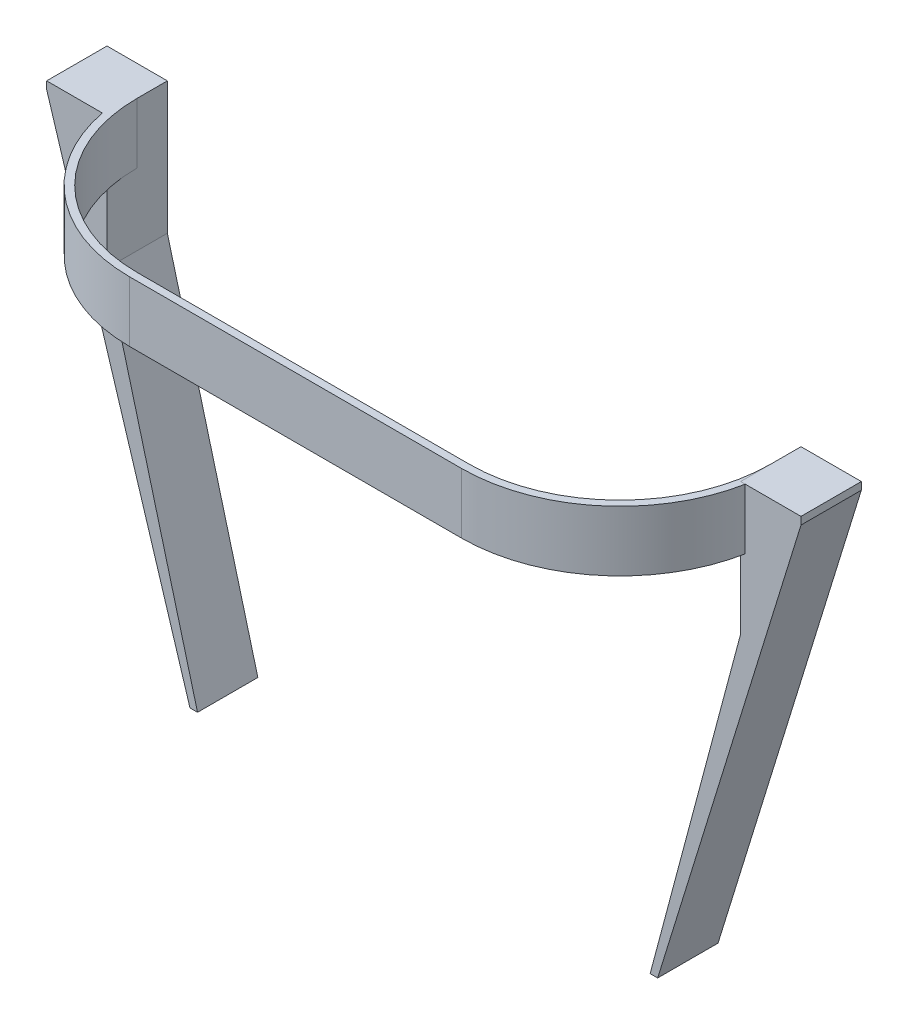
ISO-10303-21;
HEADER;
FILE_DESCRIPTION(('STEP AP214'),'2;1');
FILE_NAME('part.step','',(''),(''),'','','');
FILE_SCHEMA(('AUTOMOTIVE_DESIGN { 1 0 10303 214 1 1 1 1 }'));
ENDSEC;
DATA;
#1=APPLICATION_CONTEXT('core data for automotive mechanical design processes');
#2=APPLICATION_PROTOCOL_DEFINITION('international standard','automotive_design',2000,#1);
#3=PRODUCT_CONTEXT('',#1,'mechanical');
#4=PRODUCT('Part','Part','',(#3));
#5=PRODUCT_RELATED_PRODUCT_CATEGORY('part','',(#4));
#6=PRODUCT_DEFINITION_FORMATION('','',#4);
#7=PRODUCT_DEFINITION_CONTEXT('part definition',#1,'design');
#8=PRODUCT_DEFINITION('design','',#6,#7);
#9=PRODUCT_DEFINITION_SHAPE('','',#8);
#10=(LENGTH_UNIT() NAMED_UNIT(*) SI_UNIT(.MILLI.,.METRE.));
#11=(NAMED_UNIT(*) PLANE_ANGLE_UNIT() SI_UNIT($,.RADIAN.));
#12=(NAMED_UNIT(*) SI_UNIT($,.STERADIAN.) SOLID_ANGLE_UNIT());
#13=UNCERTAINTY_MEASURE_WITH_UNIT(LENGTH_MEASURE(1.E-05),#10,'distance_accuracy_value','');
#14=(GEOMETRIC_REPRESENTATION_CONTEXT(3) GLOBAL_UNCERTAINTY_ASSIGNED_CONTEXT((#13)) GLOBAL_UNIT_ASSIGNED_CONTEXT((#10,
#11,#12)) REPRESENTATION_CONTEXT('',''));
#15=CARTESIAN_POINT('',(0.,0.,0.));
#16=DIRECTION('',(0.,0.,1.));
#17=DIRECTION('',(1.,0.,0.));
#18=AXIS2_PLACEMENT_3D('',#15,#16,#17);
#19=CARTESIAN_POINT('',(124.,0.,32.));
#20=DIRECTION('',(0.,1.,0.));
#21=DIRECTION('',(0.,0.,1.));
#22=AXIS2_PLACEMENT_3D('',#19,#20,#21);
#23=PLANE('',#22);
#24=DIRECTION('',(1.,0.,0.));
#25=VECTOR('',#24,1.);
#26=CARTESIAN_POINT('',(124.,0.,0.));
#27=LINE('',#26,#25);
#28=CARTESIAN_POINT('',(120.,0.,0.));
#29=VERTEX_POINT('',#28);
#30=CARTESIAN_POINT('',(124.,0.,0.));
#31=VERTEX_POINT('',#30);
#32=EDGE_CURVE('E131',#29,#31,#27,.T.);
#33=ORIENTED_EDGE('',*,*,#32,.T.);
#34=DIRECTION('',(0.,0.,-1.));
#35=VECTOR('',#34,1.);
#36=CARTESIAN_POINT('',(124.,0.,32.));
#37=LINE('',#36,#35);
#38=CARTESIAN_POINT('',(124.,0.,32.));
#39=VERTEX_POINT('',#38);
#40=EDGE_CURVE('E12',#39,#31,#37,.T.);
#41=ORIENTED_EDGE('',*,*,#40,.F.);
#42=DIRECTION('',(1.,0.,0.));
#43=VECTOR('',#42,1.);
#44=CARTESIAN_POINT('',(124.,0.,32.));
#45=LINE('',#44,#43);
#46=CARTESIAN_POINT('',(120.,0.,32.));
#47=VERTEX_POINT('',#46);
#48=EDGE_CURVE('E141',#47,#39,#45,.T.);
#49=ORIENTED_EDGE('',*,*,#48,.F.);
#50=DIRECTION('',(0.,0.,-1.));
#51=VECTOR('',#50,1.);
#52=CARTESIAN_POINT('',(120.,0.,32.));
#53=LINE('',#52,#51);
#54=EDGE_CURVE('E127',#47,#29,#53,.T.);
#55=ORIENTED_EDGE('',*,*,#54,.T.);
#56=EDGE_LOOP('',(#33,#41,#49,#55));
#57=FACE_BOUND('',#56,.T.);
#58=ADVANCED_FACE('F47',(#57),#23,.F.);
#59=CARTESIAN_POINT('',(200.,246.,32.));
#60=DIRECTION('',(-0.955442479305631,0.295177351330195,0.));
#61=DIRECTION('',(-0.295177351330195,-0.955442479305631,0.));
#62=AXIS2_PLACEMENT_3D('',#59,#60,#61);
#63=PLANE('',#62);
#64=DIRECTION('',(0.295177351330195,0.955442479305631,0.));
#65=VECTOR('',#64,1.);
#66=CARTESIAN_POINT('',(200.,246.,0.));
#67=LINE('',#66,#65);
#68=CARTESIAN_POINT('',(200.,246.,0.));
#69=VERTEX_POINT('',#68);
#70=EDGE_CURVE('E134',#31,#69,#67,.T.);
#71=ORIENTED_EDGE('',*,*,#70,.T.);
#72=DIRECTION('',(0.,0.,-1.));
#73=VECTOR('',#72,1.);
#74=CARTESIAN_POINT('',(200.,246.,32.));
#75=LINE('',#74,#73);
#76=CARTESIAN_POINT('',(200.,246.,32.));
#77=VERTEX_POINT('',#76);
#78=EDGE_CURVE('E55',#77,#69,#75,.T.);
#79=ORIENTED_EDGE('',*,*,#78,.F.);
#80=DIRECTION('',(0.295177351330195,0.955442479305631,0.));
#81=VECTOR('',#80,1.);
#82=CARTESIAN_POINT('',(200.,246.,32.));
#83=LINE('',#82,#81);
#84=EDGE_CURVE('E100',#39,#77,#83,.T.);
#85=ORIENTED_EDGE('',*,*,#84,.F.);
#86=ORIENTED_EDGE('',*,*,#40,.T.);
#87=EDGE_LOOP('',(#71,#79,#85,#86));
#88=FACE_BOUND('',#87,.T.);
#89=ADVANCED_FACE('F165',(#88),#63,.F.);
#90=CARTESIAN_POINT('',(200.,250.,32.));
#91=DIRECTION('',(-1.,0.,0.));
#92=DIRECTION('',(0.,0.,1.));
#93=AXIS2_PLACEMENT_3D('',#90,#91,#92);
#94=PLANE('',#93);
#95=DIRECTION('',(0.,1.,0.));
#96=VECTOR('',#95,1.);
#97=CARTESIAN_POINT('',(200.,250.,0.));
#98=LINE('',#97,#96);
#99=CARTESIAN_POINT('',(200.,250.,0.));
#100=VERTEX_POINT('',#99);
#101=EDGE_CURVE('E136',#69,#100,#98,.T.);
#102=ORIENTED_EDGE('',*,*,#101,.T.);
#103=DIRECTION('',(0.,0.,-1.));
#104=VECTOR('',#103,1.);
#105=CARTESIAN_POINT('',(200.,250.,32.));
#106=LINE('',#105,#104);
#107=CARTESIAN_POINT('',(200.,250.,32.));
#108=VERTEX_POINT('',#107);
#109=EDGE_CURVE('E122',#108,#100,#106,.T.);
#110=ORIENTED_EDGE('',*,*,#109,.F.);
#111=DIRECTION('',(0.,1.,0.));
#112=VECTOR('',#111,1.);
#113=CARTESIAN_POINT('',(200.,250.,32.));
#114=LINE('',#113,#112);
#115=EDGE_CURVE('E113',#77,#108,#114,.T.);
#116=ORIENTED_EDGE('',*,*,#115,.F.);
#117=ORIENTED_EDGE('',*,*,#78,.T.);
#118=EDGE_LOOP('',(#102,#110,#116,#117));
#119=FACE_BOUND('',#118,.T.);
#120=ADVANCED_FACE('F147',(#119),#94,.F.);
#121=CARTESIAN_POINT('',(168.,250.,32.));
#122=DIRECTION('',(0.,-1.,0.));
#123=DIRECTION('',(1.,0.,0.));
#124=AXIS2_PLACEMENT_3D('',#121,#122,#123);
#125=PLANE('',#124);
#126=DIRECTION('',(-1.,0.,0.));
#127=VECTOR('',#126,1.);
#128=CARTESIAN_POINT('',(168.,250.,0.));
#129=LINE('',#128,#127);
#130=CARTESIAN_POINT('',(168.,250.,0.));
#131=VERTEX_POINT('',#130);
#132=EDGE_CURVE('E121',#100,#131,#129,.T.);
#133=ORIENTED_EDGE('',*,*,#132,.T.);
#134=DIRECTION('',(0.,0.,-1.));
#135=VECTOR('',#134,1.);
#136=CARTESIAN_POINT('',(168.,250.,32.));
#137=LINE('',#136,#135);
#138=CARTESIAN_POINT('',(168.,250.,32.));
#139=VERTEX_POINT('',#138);
#140=EDGE_CURVE('E118',#139,#131,#137,.T.);
#141=ORIENTED_EDGE('',*,*,#140,.F.);
#142=DIRECTION('',(-1.,0.,0.));
#143=VECTOR('',#142,1.);
#144=CARTESIAN_POINT('',(168.,250.,32.));
#145=LINE('',#144,#143);
#146=EDGE_CURVE('E107',#108,#139,#145,.T.);
#147=ORIENTED_EDGE('',*,*,#146,.F.);
#148=ORIENTED_EDGE('',*,*,#109,.T.);
#149=EDGE_LOOP('',(#133,#141,#147,#148));
#150=FACE_BOUND('',#149,.T.);
#151=ADVANCED_FACE('F119',(#150),#125,.F.);
#152=CARTESIAN_POINT('',(168.,180.,32.));
#153=DIRECTION('',(1.,0.,0.));
#154=DIRECTION('',(0.,1.,0.));
#155=AXIS2_PLACEMENT_3D('',#152,#153,#154);
#156=PLANE('',#155);
#157=DIRECTION('',(0.,-1.,0.));
#158=VECTOR('',#157,1.);
#159=CARTESIAN_POINT('',(168.,180.,0.));
#160=LINE('',#159,#158);
#161=CARTESIAN_POINT('',(168.,180.,0.));
#162=VERTEX_POINT('',#161);
#163=EDGE_CURVE('E86',#131,#162,#160,.T.);
#164=ORIENTED_EDGE('',*,*,#163,.T.);
#165=DIRECTION('',(0.,0.,-1.));
#166=VECTOR('',#165,1.);
#167=CARTESIAN_POINT('',(168.,180.,32.));
#168=LINE('',#167,#166);
#169=CARTESIAN_POINT('',(168.,180.,32.));
#170=VERTEX_POINT('',#169);
#171=EDGE_CURVE('E123',#170,#162,#168,.T.);
#172=ORIENTED_EDGE('',*,*,#171,.F.);
#173=DIRECTION('',(0.,-1.,0.));
#174=VECTOR('',#173,1.);
#175=CARTESIAN_POINT('',(168.,180.,32.));
#176=LINE('',#175,#174);
#177=EDGE_CURVE('E111',#139,#170,#176,.T.);
#178=ORIENTED_EDGE('',*,*,#177,.F.);
#179=ORIENTED_EDGE('',*,*,#140,.T.);
#180=EDGE_LOOP('',(#164,#172,#178,#179));
#181=FACE_BOUND('',#180,.T.);
#182=ADVANCED_FACE('F125',(#181),#156,.F.);
#183=CARTESIAN_POINT('',(120.,0.,32.));
#184=DIRECTION('',(0.966234939601246,-0.257662650560332,0.));
#185=DIRECTION('',(0.257662650560332,0.966234939601246,0.));
#186=AXIS2_PLACEMENT_3D('',#183,#184,#185);
#187=PLANE('',#186);
#188=DIRECTION('',(-0.257662650560332,-0.966234939601246,0.));
#189=VECTOR('',#188,1.);
#190=CARTESIAN_POINT('',(120.,0.,0.));
#191=LINE('',#190,#189);
#192=EDGE_CURVE('E92',#162,#29,#191,.T.);
#193=ORIENTED_EDGE('',*,*,#192,.T.);
#194=ORIENTED_EDGE('',*,*,#54,.F.);
#195=DIRECTION('',(-0.257662650560332,-0.966234939601246,0.));
#196=VECTOR('',#195,1.);
#197=CARTESIAN_POINT('',(120.,0.,32.));
#198=LINE('',#197,#196);
#199=EDGE_CURVE('E63',#170,#47,#198,.T.);
#200=ORIENTED_EDGE('',*,*,#199,.F.);
#201=ORIENTED_EDGE('',*,*,#171,.T.);
#202=EDGE_LOOP('',(#193,#194,#200,#201));
#203=FACE_BOUND('',#202,.T.);
#204=ADVANCED_FACE('F154',(#203),#187,.F.);
#205=CARTESIAN_POINT('',(0.,0.,32.));
#206=DIRECTION('',(0.,0.,-1.));
#207=DIRECTION('',(-1.,0.,0.));
#208=AXIS2_PLACEMENT_3D('',#205,#206,#207);
#209=PLANE('',#208);
#210=ORIENTED_EDGE('',*,*,#48,.T.);
#211=ORIENTED_EDGE('',*,*,#84,.T.);
#212=ORIENTED_EDGE('',*,*,#115,.T.);
#213=ORIENTED_EDGE('',*,*,#146,.T.);
#214=ORIENTED_EDGE('',*,*,#177,.T.);
#215=ORIENTED_EDGE('',*,*,#199,.T.);
#216=EDGE_LOOP('',(#210,#211,#212,#213,#214,#215));
#217=FACE_BOUND('',#216,.T.);
#218=ADVANCED_FACE('F109',(#217),#209,.F.);
#219=CARTESIAN_POINT('',(0.,0.,0.));
#220=DIRECTION('',(0.,0.,-1.));
#221=DIRECTION('',(-1.,0.,0.));
#222=AXIS2_PLACEMENT_3D('',#219,#220,#221);
#223=PLANE('',#222);
#224=ORIENTED_EDGE('',*,*,#32,.F.);
#225=ORIENTED_EDGE('',*,*,#192,.F.);
#226=ORIENTED_EDGE('',*,*,#163,.F.);
#227=ORIENTED_EDGE('',*,*,#132,.F.);
#228=ORIENTED_EDGE('',*,*,#101,.F.);
#229=ORIENTED_EDGE('',*,*,#70,.F.);
#230=EDGE_LOOP('',(#224,#225,#226,#227,#228,#229));
#231=FACE_BOUND('',#230,.T.);
#232=ADVANCED_FACE('F150',(#231),#223,.T.);
#233=CLOSED_SHELL('',(#58,#89,#120,#151,#182,#204,#218,#232));
#234=MANIFOLD_SOLID_BREP('B2',#233);
#235=CARTESIAN_POINT('',(-200.,246.,32.));
#236=DIRECTION('',(0.955442479305631,0.295177351330195,0.));
#237=DIRECTION('',(-0.295177351330195,0.955442479305631,0.));
#238=AXIS2_PLACEMENT_3D('',#235,#236,#237);
#239=PLANE('',#238);
#240=DIRECTION('',(0.295177351330195,-0.955442479305631,0.));
#241=VECTOR('',#240,1.);
#242=CARTESIAN_POINT('',(-200.,246.,0.));
#243=LINE('',#242,#241);
#244=CARTESIAN_POINT('',(-200.,246.,0.));
#245=VERTEX_POINT('',#244);
#246=CARTESIAN_POINT('',(-124.,0.,0.));
#247=VERTEX_POINT('',#246);
#248=EDGE_CURVE('E411',#245,#247,#243,.T.);
#249=ORIENTED_EDGE('',*,*,#248,.T.);
#250=DIRECTION('',(0.,0.,-1.));
#251=VECTOR('',#250,1.);
#252=CARTESIAN_POINT('',(-124.,0.,32.));
#253=LINE('',#252,#251);
#254=CARTESIAN_POINT('',(-124.,0.,32.));
#255=VERTEX_POINT('',#254);
#256=EDGE_CURVE('E468',#255,#247,#253,.T.);
#257=ORIENTED_EDGE('',*,*,#256,.F.);
#258=DIRECTION('',(0.295177351330195,-0.955442479305631,0.));
#259=VECTOR('',#258,1.);
#260=CARTESIAN_POINT('',(-200.,246.,32.));
#261=LINE('',#260,#259);
#262=CARTESIAN_POINT('',(-200.,246.,32.));
#263=VERTEX_POINT('',#262);
#264=EDGE_CURVE('E412',#263,#255,#261,.T.);
#265=ORIENTED_EDGE('',*,*,#264,.F.);
#266=DIRECTION('',(0.,0.,-1.));
#267=VECTOR('',#266,1.);
#268=CARTESIAN_POINT('',(-200.,246.,32.));
#269=LINE('',#268,#267);
#270=EDGE_CURVE('E433',#263,#245,#269,.T.);
#271=ORIENTED_EDGE('',*,*,#270,.T.);
#272=EDGE_LOOP('',(#249,#257,#265,#271));
#273=FACE_BOUND('',#272,.T.);
#274=ADVANCED_FACE('F223',(#273),#239,.F.);
#275=CARTESIAN_POINT('',(-124.,0.,32.));
#276=DIRECTION('',(0.,1.,0.));
#277=DIRECTION('',(0.,0.,1.));
#278=AXIS2_PLACEMENT_3D('',#275,#276,#277);
#279=PLANE('',#278);
#280=DIRECTION('',(1.,0.,0.));
#281=VECTOR('',#280,1.);
#282=CARTESIAN_POINT('',(-124.,0.,0.));
#283=LINE('',#282,#281);
#284=CARTESIAN_POINT('',(-120.,0.,0.));
#285=VERTEX_POINT('',#284);
#286=EDGE_CURVE('E437',#247,#285,#283,.T.);
#287=ORIENTED_EDGE('',*,*,#286,.T.);
#288=DIRECTION('',(0.,0.,-1.));
#289=VECTOR('',#288,1.);
#290=CARTESIAN_POINT('',(-120.,0.,32.));
#291=LINE('',#290,#289);
#292=CARTESIAN_POINT('',(-120.,0.,32.));
#293=VERTEX_POINT('',#292);
#294=EDGE_CURVE('E464',#293,#285,#291,.T.);
#295=ORIENTED_EDGE('',*,*,#294,.F.);
#296=DIRECTION('',(1.,0.,0.));
#297=VECTOR('',#296,1.);
#298=CARTESIAN_POINT('',(-124.,0.,32.));
#299=LINE('',#298,#297);
#300=EDGE_CURVE('E416',#255,#293,#299,.T.);
#301=ORIENTED_EDGE('',*,*,#300,.F.);
#302=ORIENTED_EDGE('',*,*,#256,.T.);
#303=EDGE_LOOP('',(#287,#295,#301,#302));
#304=FACE_BOUND('',#303,.T.);
#305=ADVANCED_FACE('F507',(#304),#279,.F.);
#306=CARTESIAN_POINT('',(-120.,0.,32.));
#307=DIRECTION('',(-0.966234939601246,-0.257662650560332,0.));
#308=DIRECTION('',(0.257662650560332,-0.966234939601246,0.));
#309=AXIS2_PLACEMENT_3D('',#306,#307,#308);
#310=PLANE('',#309);
#311=DIRECTION('',(-0.257662650560332,0.966234939601246,0.));
#312=VECTOR('',#311,1.);
#313=CARTESIAN_POINT('',(-120.,0.,0.));
#314=LINE('',#313,#312);
#315=CARTESIAN_POINT('',(-168.,180.,0.));
#316=VERTEX_POINT('',#315);
#317=EDGE_CURVE('E440',#285,#316,#314,.T.);
#318=ORIENTED_EDGE('',*,*,#317,.T.);
#319=DIRECTION('',(0.,0.,-1.));
#320=VECTOR('',#319,1.);
#321=CARTESIAN_POINT('',(-168.,180.,32.));
#322=LINE('',#321,#320);
#323=CARTESIAN_POINT('',(-168.,180.,32.));
#324=VERTEX_POINT('',#323);
#325=EDGE_CURVE('E460',#324,#316,#322,.T.);
#326=ORIENTED_EDGE('',*,*,#325,.F.);
#327=DIRECTION('',(-0.257662650560332,0.966234939601246,0.));
#328=VECTOR('',#327,1.);
#329=CARTESIAN_POINT('',(-120.,0.,32.));
#330=LINE('',#329,#328);
#331=EDGE_CURVE('E420',#293,#324,#330,.T.);
#332=ORIENTED_EDGE('',*,*,#331,.F.);
#333=ORIENTED_EDGE('',*,*,#294,.T.);
#334=EDGE_LOOP('',(#318,#326,#332,#333));
#335=FACE_BOUND('',#334,.T.);
#336=ADVANCED_FACE('F512',(#335),#310,.F.);
#337=CARTESIAN_POINT('',(-168.,180.,32.));
#338=DIRECTION('',(-1.,0.,0.));
#339=DIRECTION('',(0.,-1.,0.));
#340=AXIS2_PLACEMENT_3D('',#337,#338,#339);
#341=PLANE('',#340);
#342=DIRECTION('',(0.,0.,-1.));
#343=VECTOR('',#342,1.);
#344=CARTESIAN_POINT('',(-168.,250.,32.));
#345=LINE('',#344,#343);
#346=CARTESIAN_POINT('',(-168.,250.,16.));
#347=VERTEX_POINT('',#346);
#348=CARTESIAN_POINT('',(-168.,250.,0.));
#349=VERTEX_POINT('',#348);
#350=EDGE_CURVE('E243',#347,#349,#345,.T.);
#351=ORIENTED_EDGE('',*,*,#350,.F.);
#352=DIRECTION('',(0.,1.,0.));
#353=VECTOR('',#352,1.);
#354=CARTESIAN_POINT('',(-168.,217.999999999999,16.));
#355=LINE('',#354,#353);
#356=CARTESIAN_POINT('',(-168.,217.999999999999,16.));
#357=VERTEX_POINT('',#356);
#358=EDGE_CURVE('E238',#357,#347,#355,.T.);
#359=ORIENTED_EDGE('',*,*,#358,.F.);
#360=DIRECTION('',(0.,0.,-1.));
#361=VECTOR('',#360,1.);
#362=CARTESIAN_POINT('',(-168.,217.999999999999,32.));
#363=LINE('',#362,#361);
#364=CARTESIAN_POINT('',(-168.,217.999999999999,32.));
#365=VERTEX_POINT('',#364);
#366=EDGE_CURVE('E395',#365,#357,#363,.T.);
#367=ORIENTED_EDGE('',*,*,#366,.F.);
#368=DIRECTION('',(0.,1.,0.));
#369=VECTOR('',#368,1.);
#370=CARTESIAN_POINT('',(-168.,180.,32.));
#371=LINE('',#370,#369);
#372=EDGE_CURVE('E423',#324,#365,#371,.T.);
#373=ORIENTED_EDGE('',*,*,#372,.F.);
#374=ORIENTED_EDGE('',*,*,#325,.T.);
#375=DIRECTION('',(0.,1.,0.));
#376=VECTOR('',#375,1.);
#377=CARTESIAN_POINT('',(-168.,180.,0.));
#378=LINE('',#377,#376);
#379=EDGE_CURVE('E443',#316,#349,#378,.T.);
#380=ORIENTED_EDGE('',*,*,#379,.T.);
#381=EDGE_LOOP('',(#351,#359,#367,#373,#374,#380));
#382=FACE_BOUND('',#381,.T.);
#383=ADVANCED_FACE('F515',(#382),#341,.F.);
#384=CARTESIAN_POINT('',(-168.,250.,32.));
#385=DIRECTION('',(0.,-1.,0.));
#386=DIRECTION('',(0.,0.,-1.));
#387=AXIS2_PLACEMENT_3D('',#384,#385,#386);
#388=PLANE('',#387);
#389=CARTESIAN_POINT('',(-88.0000000000001,249.999999999999,16.));
#390=DIRECTION('',(0.,-1.,0.));
#391=DIRECTION('',(-1.,0.,0.));
#392=AXIS2_PLACEMENT_3D('',#389,#390,#391);
#393=CIRCLE('',#392,80.);
#394=CARTESIAN_POINT('',(-88.0000000000001,249.999999999999,96.0000000000001));
#395=VERTEX_POINT('',#394);
#396=EDGE_CURVE('E367',#395,#347,#393,.T.);
#397=ORIENTED_EDGE('',*,*,#396,.T.);
#398=ORIENTED_EDGE('',*,*,#350,.T.);
#399=DIRECTION('',(-1.,0.,0.));
#400=VECTOR('',#399,1.);
#401=CARTESIAN_POINT('',(-168.,250.,0.));
#402=LINE('',#401,#400);
#403=CARTESIAN_POINT('',(-200.,250.,0.));
#404=VERTEX_POINT('',#403);
#405=EDGE_CURVE('E446',#349,#404,#402,.T.);
#406=ORIENTED_EDGE('',*,*,#405,.T.);
#407=DIRECTION('',(0.,0.,-1.));
#408=VECTOR('',#407,1.);
#409=CARTESIAN_POINT('',(-200.,250.,32.));
#410=LINE('',#409,#408);
#411=CARTESIAN_POINT('',(-200.,250.,32.));
#412=VERTEX_POINT('',#411);
#413=EDGE_CURVE('E454',#412,#404,#410,.T.);
#414=ORIENTED_EDGE('',*,*,#413,.F.);
#415=DIRECTION('',(-1.,0.,0.));
#416=VECTOR('',#415,1.);
#417=CARTESIAN_POINT('',(-168.,250.,32.));
#418=LINE('',#417,#416);
#419=CARTESIAN_POINT('',(-170.462112512353,249.999999999999,32.));
#420=VERTEX_POINT('',#419);
#421=EDGE_CURVE('E427',#420,#412,#418,.T.);
#422=ORIENTED_EDGE('',*,*,#421,.F.);
#423=CARTESIAN_POINT('',(-88.0000000000001,249.999999999999,16.));
#424=DIRECTION('',(0.,1.,0.));
#425=DIRECTION('',(-1.,0.,0.));
#426=AXIS2_PLACEMENT_3D('',#423,#424,#425);
#427=CIRCLE('',#426,84.);
#428=CARTESIAN_POINT('',(-88.0000000000001,249.999999999999,100.));
#429=VERTEX_POINT('',#428);
#430=EDGE_CURVE('E371',#420,#429,#427,.T.);
#431=ORIENTED_EDGE('',*,*,#430,.T.);
#432=DIRECTION('',(1.,0.,0.));
#433=VECTOR('',#432,1.);
#434=CARTESIAN_POINT('',(-88.0000000000001,249.999999999999,100.));
#435=LINE('',#434,#433);
#436=CARTESIAN_POINT('',(88.,250.,100.));
#437=VERTEX_POINT('',#436);
#438=EDGE_CURVE('E340',#429,#437,#435,.T.);
#439=ORIENTED_EDGE('',*,*,#438,.T.);
#440=CARTESIAN_POINT('',(87.9999999999999,250.,16.));
#441=DIRECTION('',(0.,1.,0.));
#442=DIRECTION('',(-1.,0.,0.));
#443=AXIS2_PLACEMENT_3D('',#440,#441,#442);
#444=CIRCLE('',#443,84.);
#445=CARTESIAN_POINT('',(172.,250.,16.));
#446=VERTEX_POINT('',#445);
#447=EDGE_CURVE('E376',#437,#446,#444,.T.);
#448=ORIENTED_EDGE('',*,*,#447,.T.);
#449=DIRECTION('',(-1.,0.,0.));
#450=VECTOR('',#449,1.);
#451=CARTESIAN_POINT('',(168.,250.,16.));
#452=LINE('',#451,#450);
#453=CARTESIAN_POINT('',(168.,250.,16.));
#454=VERTEX_POINT('',#453);
#455=EDGE_CURVE('E380',#446,#454,#452,.T.);
#456=ORIENTED_EDGE('',*,*,#455,.T.);
#457=CARTESIAN_POINT('',(87.9999999999999,250.,16.));
#458=DIRECTION('',(0.,-1.,0.));
#459=DIRECTION('',(-1.,0.,0.));
#460=AXIS2_PLACEMENT_3D('',#457,#458,#459);
#461=CIRCLE('',#460,80.);
#462=CARTESIAN_POINT('',(87.9999999999999,250.,96.0000000000001));
#463=VERTEX_POINT('',#462);
#464=EDGE_CURVE('E384',#454,#463,#461,.T.);
#465=ORIENTED_EDGE('',*,*,#464,.T.);
#466=DIRECTION('',(-1.,0.,0.));
#467=VECTOR('',#466,1.);
#468=CARTESIAN_POINT('',(-88.0000000000001,249.999999999999,96.0000000000001));
#469=LINE('',#468,#467);
#470=EDGE_CURVE('E388',#463,#395,#469,.T.);
#471=ORIENTED_EDGE('',*,*,#470,.T.);
#472=EDGE_LOOP('',(#397,#398,#406,#414,#422,#431,#439,#448,#456,#465,#471));
#473=FACE_BOUND('',#472,.T.);
#474=ADVANCED_FACE('F495',(#473),#388,.F.);
#475=CARTESIAN_POINT('',(-200.,250.,32.));
#476=DIRECTION('',(1.,0.,0.));
#477=DIRECTION('',(0.,0.,-1.));
#478=AXIS2_PLACEMENT_3D('',#475,#476,#477);
#479=PLANE('',#478);
#480=DIRECTION('',(0.,-1.,0.));
#481=VECTOR('',#480,1.);
#482=CARTESIAN_POINT('',(-200.,250.,0.));
#483=LINE('',#482,#481);
#484=EDGE_CURVE('E417',#404,#245,#483,.T.);
#485=ORIENTED_EDGE('',*,*,#484,.T.);
#486=ORIENTED_EDGE('',*,*,#270,.F.);
#487=DIRECTION('',(0.,-1.,0.));
#488=VECTOR('',#487,1.);
#489=CARTESIAN_POINT('',(-200.,250.,32.));
#490=LINE('',#489,#488);
#491=EDGE_CURVE('E430',#412,#263,#490,.T.);
#492=ORIENTED_EDGE('',*,*,#491,.F.);
#493=ORIENTED_EDGE('',*,*,#413,.T.);
#494=EDGE_LOOP('',(#485,#486,#492,#493));
#495=FACE_BOUND('',#494,.T.);
#496=ADVANCED_FACE('F502',(#495),#479,.F.);
#497=CARTESIAN_POINT('',(0.,0.,32.));
#498=DIRECTION('',(0.,0.,1.));
#499=DIRECTION('',(1.,0.,0.));
#500=AXIS2_PLACEMENT_3D('',#497,#498,#499);
#501=PLANE('',#500);
#502=DIRECTION('',(0.,1.,0.));
#503=VECTOR('',#502,1.);
#504=CARTESIAN_POINT('',(-170.462112512353,217.999999999999,32.));
#505=LINE('',#504,#503);
#506=CARTESIAN_POINT('',(-170.462112512353,217.999999999999,32.));
#507=VERTEX_POINT('',#506);
#508=EDGE_CURVE('E45',#420,#507,#505,.F.);
#509=ORIENTED_EDGE('',*,*,#508,.F.);
#510=ORIENTED_EDGE('',*,*,#421,.T.);
#511=ORIENTED_EDGE('',*,*,#491,.T.);
#512=ORIENTED_EDGE('',*,*,#264,.T.);
#513=ORIENTED_EDGE('',*,*,#300,.T.);
#514=ORIENTED_EDGE('',*,*,#331,.T.);
#515=ORIENTED_EDGE('',*,*,#372,.T.);
#516=DIRECTION('',(-1.,0.,0.));
#517=VECTOR('',#516,1.);
#518=CARTESIAN_POINT('',(-7.56339435525886E-13,217.999999999999,32.));
#519=LINE('',#518,#517);
#520=EDGE_CURVE('E231',#365,#507,#519,.T.);
#521=ORIENTED_EDGE('',*,*,#520,.T.);
#522=EDGE_LOOP('',(#509,#510,#511,#512,#513,#514,#515,#521));
#523=FACE_BOUND('',#522,.T.);
#524=ADVANCED_FACE('F473',(#523),#501,.T.);
#525=CARTESIAN_POINT('',(0.,0.,0.));
#526=DIRECTION('',(0.,0.,1.));
#527=DIRECTION('',(1.,0.,0.));
#528=AXIS2_PLACEMENT_3D('',#525,#526,#527);
#529=PLANE('',#528);
#530=ORIENTED_EDGE('',*,*,#248,.F.);
#531=ORIENTED_EDGE('',*,*,#484,.F.);
#532=ORIENTED_EDGE('',*,*,#405,.F.);
#533=ORIENTED_EDGE('',*,*,#379,.F.);
#534=ORIENTED_EDGE('',*,*,#317,.F.);
#535=ORIENTED_EDGE('',*,*,#286,.F.);
#536=EDGE_LOOP('',(#530,#531,#532,#533,#534,#535));
#537=FACE_BOUND('',#536,.T.);
#538=ADVANCED_FACE('F551',(#537),#529,.F.);
#539=CARTESIAN_POINT('',(-88.,217.999999999999,16.));
#540=DIRECTION('',(0.,1.,0.));
#541=DIRECTION('',(-1.,0.,0.));
#542=AXIS2_PLACEMENT_3D('',#539,#540,#541);
#543=PLANE('',#542);
#544=ORIENTED_EDGE('',*,*,#520,.F.);
#545=ORIENTED_EDGE('',*,*,#366,.T.);
#546=CARTESIAN_POINT('',(-88.,217.999999999999,16.));
#547=DIRECTION('',(0.,-1.,0.));
#548=DIRECTION('',(-1.,0.,0.));
#549=AXIS2_PLACEMENT_3D('',#546,#547,#548);
#550=CIRCLE('',#549,80.);
#551=CARTESIAN_POINT('',(-88.,217.999999999999,96.0000000000001));
#552=VERTEX_POINT('',#551);
#553=EDGE_CURVE('E334',#552,#357,#550,.T.);
#554=ORIENTED_EDGE('',*,*,#553,.F.);
#555=DIRECTION('',(-1.,0.,0.));
#556=VECTOR('',#555,1.);
#557=CARTESIAN_POINT('',(-88.,217.999999999999,96.0000000000001));
#558=LINE('',#557,#556);
#559=CARTESIAN_POINT('',(88.,218.,96.0000000000001));
#560=VERTEX_POINT('',#559);
#561=EDGE_CURVE('E363',#560,#552,#558,.T.);
#562=ORIENTED_EDGE('',*,*,#561,.F.);
#563=CARTESIAN_POINT('',(88.,218.,16.));
#564=DIRECTION('',(0.,-1.,0.));
#565=DIRECTION('',(-1.,0.,0.));
#566=AXIS2_PLACEMENT_3D('',#563,#564,#565);
#567=CIRCLE('',#566,80.);
#568=CARTESIAN_POINT('',(168.,218.,16.));
#569=VERTEX_POINT('',#568);
#570=EDGE_CURVE('E359',#569,#560,#567,.T.);
#571=ORIENTED_EDGE('',*,*,#570,.F.);
#572=DIRECTION('',(-1.,0.,0.));
#573=VECTOR('',#572,1.);
#574=CARTESIAN_POINT('',(168.,218.,16.));
#575=LINE('',#574,#573);
#576=CARTESIAN_POINT('',(172.,218.,16.));
#577=VERTEX_POINT('',#576);
#578=EDGE_CURVE('E352',#577,#569,#575,.T.);
#579=ORIENTED_EDGE('',*,*,#578,.F.);
#580=CARTESIAN_POINT('',(88.,218.,16.));
#581=DIRECTION('',(0.,1.,0.));
#582=DIRECTION('',(-1.,0.,0.));
#583=AXIS2_PLACEMENT_3D('',#580,#581,#582);
#584=CIRCLE('',#583,84.);
#585=CARTESIAN_POINT('',(88.0000000000001,218.,100.));
#586=VERTEX_POINT('',#585);
#587=EDGE_CURVE('E348',#586,#577,#584,.T.);
#588=ORIENTED_EDGE('',*,*,#587,.F.);
#589=DIRECTION('',(1.,0.,0.));
#590=VECTOR('',#589,1.);
#591=CARTESIAN_POINT('',(-88.,217.999999999999,100.));
#592=LINE('',#591,#590);
#593=CARTESIAN_POINT('',(-88.,217.999999999999,100.));
#594=VERTEX_POINT('',#593);
#595=EDGE_CURVE('E333',#594,#586,#592,.T.);
#596=ORIENTED_EDGE('',*,*,#595,.F.);
#597=CARTESIAN_POINT('',(-88.,217.999999999999,16.));
#598=DIRECTION('',(0.,1.,0.));
#599=DIRECTION('',(-1.,0.,0.));
#600=AXIS2_PLACEMENT_3D('',#597,#598,#599);
#601=CIRCLE('',#600,84.);
#602=EDGE_CURVE('E322',#507,#594,#601,.T.);
#603=ORIENTED_EDGE('',*,*,#602,.F.);
#604=EDGE_LOOP('',(#544,#545,#554,#562,#571,#579,#588,#596,#603));
#605=FACE_BOUND('',#604,.T.);
#606=ADVANCED_FACE('F345',(#605),#543,.F.);
#607=CARTESIAN_POINT('',(-88.,217.999999999999,16.));
#608=DIRECTION('',(0.,1.,0.));
#609=DIRECTION('',(-1.,0.,0.));
#610=AXIS2_PLACEMENT_3D('',#607,#608,#609);
#611=CYLINDRICAL_SURFACE('',#610,80.);
#612=ORIENTED_EDGE('',*,*,#396,.F.);
#613=DIRECTION('',(0.,1.,0.));
#614=VECTOR('',#613,1.);
#615=CARTESIAN_POINT('',(-88.,217.999999999999,96.0000000000001));
#616=LINE('',#615,#614);
#617=EDGE_CURVE('E392',#552,#395,#616,.T.);
#618=ORIENTED_EDGE('',*,*,#617,.F.);
#619=ORIENTED_EDGE('',*,*,#553,.T.);
#620=ORIENTED_EDGE('',*,*,#358,.T.);
#621=EDGE_LOOP('',(#612,#618,#619,#620));
#622=FACE_BOUND('',#621,.T.);
#623=ADVANCED_FACE('F480',(#622),#611,.F.);
#624=CARTESIAN_POINT('',(-88.,217.999999999999,96.0000000000001));
#625=DIRECTION('',(0.,0.,-1.));
#626=DIRECTION('',(-1.,0.,0.));
#627=AXIS2_PLACEMENT_3D('',#624,#625,#626);
#628=PLANE('',#627);
#629=ORIENTED_EDGE('',*,*,#470,.F.);
#630=DIRECTION('',(0.,1.,0.));
#631=VECTOR('',#630,1.);
#632=CARTESIAN_POINT('',(88.,218.,96.0000000000001));
#633=LINE('',#632,#631);
#634=EDGE_CURVE('E396',#560,#463,#633,.T.);
#635=ORIENTED_EDGE('',*,*,#634,.F.);
#636=ORIENTED_EDGE('',*,*,#561,.T.);
#637=ORIENTED_EDGE('',*,*,#617,.T.);
#638=EDGE_LOOP('',(#629,#635,#636,#637));
#639=FACE_BOUND('',#638,.T.);
#640=ADVANCED_FACE('F484',(#639),#628,.T.);
#641=CARTESIAN_POINT('',(88.,218.,16.));
#642=DIRECTION('',(0.,1.,0.));
#643=DIRECTION('',(-1.,0.,0.));
#644=AXIS2_PLACEMENT_3D('',#641,#642,#643);
#645=CYLINDRICAL_SURFACE('',#644,80.);
#646=ORIENTED_EDGE('',*,*,#464,.F.);
#647=DIRECTION('',(0.,1.,0.));
#648=VECTOR('',#647,1.);
#649=CARTESIAN_POINT('',(168.,218.,16.));
#650=LINE('',#649,#648);
#651=EDGE_CURVE('E399',#569,#454,#650,.T.);
#652=ORIENTED_EDGE('',*,*,#651,.F.);
#653=ORIENTED_EDGE('',*,*,#570,.T.);
#654=ORIENTED_EDGE('',*,*,#634,.T.);
#655=EDGE_LOOP('',(#646,#652,#653,#654));
#656=FACE_BOUND('',#655,.T.);
#657=ADVANCED_FACE('F596',(#656),#645,.F.);
#658=CARTESIAN_POINT('',(168.,218.,16.));
#659=DIRECTION('',(0.,0.,-1.));
#660=DIRECTION('',(-1.,0.,0.));
#661=AXIS2_PLACEMENT_3D('',#658,#659,#660);
#662=PLANE('',#661);
#663=ORIENTED_EDGE('',*,*,#455,.F.);
#664=DIRECTION('',(0.,1.,0.));
#665=VECTOR('',#664,1.);
#666=CARTESIAN_POINT('',(172.,218.,16.));
#667=LINE('',#666,#665);
#668=EDGE_CURVE('E402',#577,#446,#667,.T.);
#669=ORIENTED_EDGE('',*,*,#668,.F.);
#670=ORIENTED_EDGE('',*,*,#578,.T.);
#671=ORIENTED_EDGE('',*,*,#651,.T.);
#672=EDGE_LOOP('',(#663,#669,#670,#671));
#673=FACE_BOUND('',#672,.T.);
#674=ADVANCED_FACE('F489',(#673),#662,.T.);
#675=CARTESIAN_POINT('',(88.,218.,16.));
#676=DIRECTION('',(0.,1.,0.));
#677=DIRECTION('',(-1.,0.,0.));
#678=AXIS2_PLACEMENT_3D('',#675,#676,#677);
#679=CYLINDRICAL_SURFACE('',#678,84.);
#680=ORIENTED_EDGE('',*,*,#447,.F.);
#681=DIRECTION('',(0.,1.,0.));
#682=VECTOR('',#681,1.);
#683=CARTESIAN_POINT('',(88.0000000000001,218.,100.));
#684=LINE('',#683,#682);
#685=EDGE_CURVE('E342',#586,#437,#684,.T.);
#686=ORIENTED_EDGE('',*,*,#685,.F.);
#687=ORIENTED_EDGE('',*,*,#587,.T.);
#688=ORIENTED_EDGE('',*,*,#668,.T.);
#689=EDGE_LOOP('',(#680,#686,#687,#688));
#690=FACE_BOUND('',#689,.T.);
#691=ADVANCED_FACE('F493',(#690),#679,.T.);
#692=CARTESIAN_POINT('',(-88.,217.999999999999,100.));
#693=DIRECTION('',(0.,0.,1.));
#694=DIRECTION('',(1.,0.,0.));
#695=AXIS2_PLACEMENT_3D('',#692,#693,#694);
#696=PLANE('',#695);
#697=ORIENTED_EDGE('',*,*,#438,.F.);
#698=DIRECTION('',(0.,1.,0.));
#699=VECTOR('',#698,1.);
#700=CARTESIAN_POINT('',(-88.,217.999999999999,100.));
#701=LINE('',#700,#699);
#702=EDGE_CURVE('E326',#594,#429,#701,.T.);
#703=ORIENTED_EDGE('',*,*,#702,.F.);
#704=ORIENTED_EDGE('',*,*,#595,.T.);
#705=ORIENTED_EDGE('',*,*,#685,.T.);
#706=EDGE_LOOP('',(#697,#703,#704,#705));
#707=FACE_BOUND('',#706,.T.);
#708=ADVANCED_FACE('F338',(#707),#696,.T.);
#709=CARTESIAN_POINT('',(-88.,217.999999999999,16.));
#710=DIRECTION('',(0.,1.,0.));
#711=DIRECTION('',(-1.,0.,0.));
#712=AXIS2_PLACEMENT_3D('',#709,#710,#711);
#713=CYLINDRICAL_SURFACE('',#712,84.);
#714=ORIENTED_EDGE('',*,*,#430,.F.);
#715=ORIENTED_EDGE('',*,*,#508,.T.);
#716=ORIENTED_EDGE('',*,*,#602,.T.);
#717=ORIENTED_EDGE('',*,*,#702,.T.);
#718=EDGE_LOOP('',(#714,#715,#716,#717));
#719=FACE_BOUND('',#718,.T.);
#720=ADVANCED_FACE('F325',(#719),#713,.T.);
#721=CLOSED_SHELL('',(#274,#305,#336,#383,#474,#496,#524,#538,#606,#623,#640,#657,#674,#691,
#708,#720));
#722=MANIFOLD_SOLID_BREP('B6',#721);
#723=ADVANCED_BREP_SHAPE_REPRESENTATION('',(#18,#234,#722),#14);
#724=SHAPE_DEFINITION_REPRESENTATION(#9,#723);
ENDSEC;
END-ISO-10303-21;
